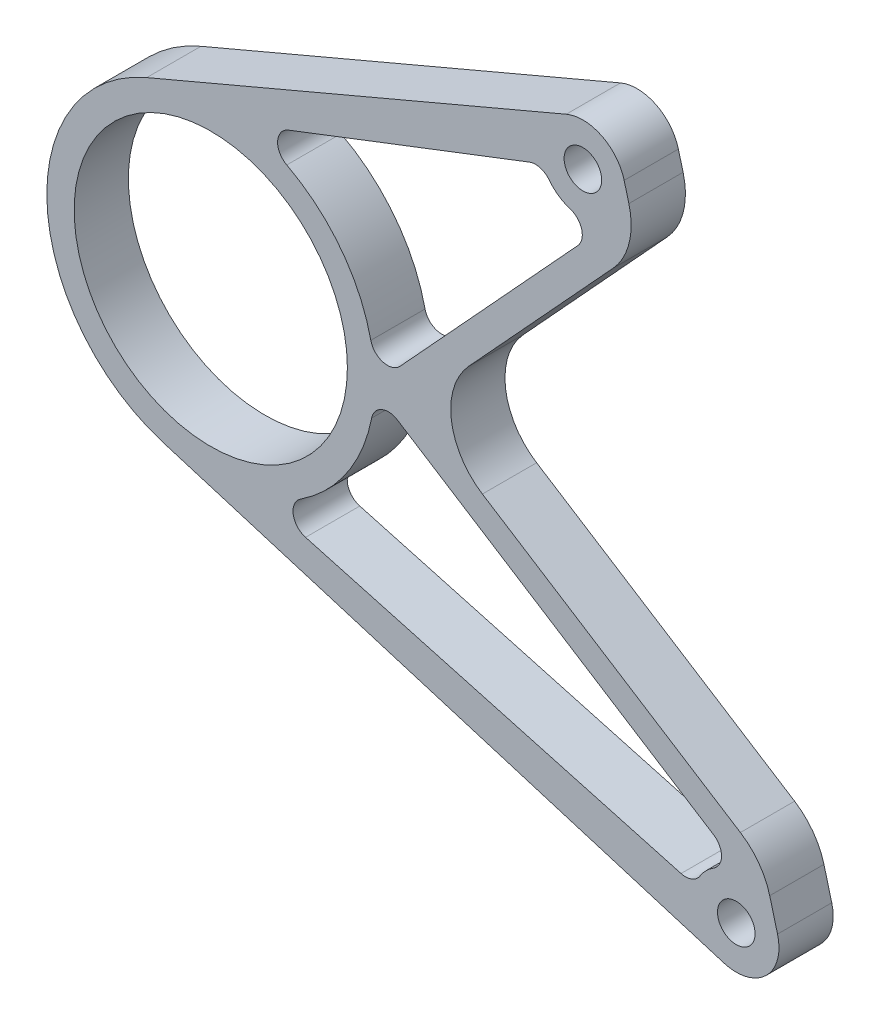
ISO-10303-21;
HEADER;
FILE_DESCRIPTION(('STEP AP214'),'2;1');
FILE_NAME('part.step','',(''),(''),'','','');
FILE_SCHEMA(('AUTOMOTIVE_DESIGN { 1 0 10303 214 1 1 1 1 }'));
ENDSEC;
DATA;
#1=APPLICATION_CONTEXT('core data for automotive mechanical design processes');
#2=APPLICATION_PROTOCOL_DEFINITION('international standard','automotive_design',2000,#1);
#3=PRODUCT_CONTEXT('',#1,'mechanical');
#4=PRODUCT('Part','Part','',(#3));
#5=PRODUCT_RELATED_PRODUCT_CATEGORY('part','',(#4));
#6=PRODUCT_DEFINITION_FORMATION('','',#4);
#7=PRODUCT_DEFINITION_CONTEXT('part definition',#1,'design');
#8=PRODUCT_DEFINITION('design','',#6,#7);
#9=PRODUCT_DEFINITION_SHAPE('','',#8);
#10=(LENGTH_UNIT() NAMED_UNIT(*) SI_UNIT(.MILLI.,.METRE.));
#11=(NAMED_UNIT(*) PLANE_ANGLE_UNIT() SI_UNIT($,.RADIAN.));
#12=(NAMED_UNIT(*) SI_UNIT($,.STERADIAN.) SOLID_ANGLE_UNIT());
#13=UNCERTAINTY_MEASURE_WITH_UNIT(LENGTH_MEASURE(1.E-05),#10,'distance_accuracy_value','');
#14=(GEOMETRIC_REPRESENTATION_CONTEXT(3) GLOBAL_UNCERTAINTY_ASSIGNED_CONTEXT((#13)) GLOBAL_UNIT_ASSIGNED_CONTEXT((#10,
#11,#12)) REPRESENTATION_CONTEXT('',''));
#15=CARTESIAN_POINT('',(0.,0.,0.));
#16=DIRECTION('',(0.,0.,1.));
#17=DIRECTION('',(1.,0.,0.));
#18=AXIS2_PLACEMENT_3D('',#15,#16,#17);
#19=CARTESIAN_POINT('',(37.2580750634411,-180.788741440238,15.875));
#20=DIRECTION('',(-0.966328629535843,-0.257311056387749,0.));
#21=DIRECTION('',(0.257311056387749,-0.966328629535843,0.));
#22=AXIS2_PLACEMENT_3D('',#19,#20,#21);
#23=PLANE('',#22);
#24=DIRECTION('',(-0.257311056387749,0.966328629535843,0.));
#25=VECTOR('',#24,1.);
#26=CARTESIAN_POINT('',(37.2580750634411,-180.788741440238,0.));
#27=LINE('',#26,#25);
#28=CARTESIAN_POINT('',(37.2580750634411,-180.788741440238,0.));
#29=VERTEX_POINT('',#28);
#30=CARTESIAN_POINT('',(34.971365168203,-172.201029469239,0.));
#31=VERTEX_POINT('',#30);
#32=EDGE_CURVE('E462',#29,#31,#27,.T.);
#33=ORIENTED_EDGE('',*,*,#32,.T.);
#34=DIRECTION('',(0.,0.,1.));
#35=VECTOR('',#34,1.);
#36=CARTESIAN_POINT('',(34.971365168203,-172.201029469239,15.875));
#37=LINE('',#36,#35);
#38=CARTESIAN_POINT('',(34.971365168203,-172.201029469239,15.875));
#39=VERTEX_POINT('',#38);
#40=EDGE_CURVE('E335',#31,#39,#37,.T.);
#41=ORIENTED_EDGE('',*,*,#40,.T.);
#42=DIRECTION('',(-0.257311056387749,0.966328629535843,0.));
#43=VECTOR('',#42,1.);
#44=CARTESIAN_POINT('',(37.2580750634411,-180.788741440238,15.875));
#45=LINE('',#44,#43);
#46=CARTESIAN_POINT('',(37.2580750634411,-180.788741440238,15.875));
#47=VERTEX_POINT('',#46);
#48=EDGE_CURVE('E450',#47,#39,#45,.T.);
#49=ORIENTED_EDGE('',*,*,#48,.F.);
#50=DIRECTION('',(0.,0.,-1.));
#51=VECTOR('',#50,1.);
#52=CARTESIAN_POINT('',(37.2580750634411,-180.788741440238,15.875));
#53=LINE('',#52,#51);
#54=EDGE_CURVE('E262',#47,#29,#53,.T.);
#55=ORIENTED_EDGE('',*,*,#54,.T.);
#56=EDGE_LOOP('',(#33,#41,#49,#55));
#57=FACE_BOUND('',#56,.T.);
#58=ADVANCED_FACE('F44',(#57),#23,.F.);
#59=CARTESIAN_POINT('',(-128.679206861492,-100.153402069267,15.875));
#60=DIRECTION('',(0.,0.,1.));
#61=DIRECTION('',(1.,0.,0.));
#62=AXIS2_PLACEMENT_3D('',#59,#60,#61);
#63=PLANE('',#62);
#64=ORIENTED_EDGE('',*,*,#48,.T.);
#65=CARTESIAN_POINT('',(15.6447925774861,-177.347250596994,15.875));
#66=DIRECTION('',(0.,0.,1.));
#67=DIRECTION('',(1.,0.,0.));
#68=AXIS2_PLACEMENT_3D('',#65,#66,#67);
#69=CIRCLE('',#68,20.);
#70=CARTESIAN_POINT('',(26.3798790276327,-160.472478927194,15.875));
#71=VERTEX_POINT('',#70);
#72=EDGE_CURVE('E340',#39,#71,#69,.T.);
#73=ORIENTED_EDGE('',*,*,#72,.T.);
#74=DIRECTION('',(0.843738583489993,-0.536754322507327,0.));
#75=VECTOR('',#74,1.);
#76=CARTESIAN_POINT('',(-69.306214402676,-99.6006339534629,15.875));
#77=LINE('',#76,#75);
#78=CARTESIAN_POINT('',(-49.1531232196023,-112.421262304551,15.875));
#79=VERTEX_POINT('',#78);
#80=EDGE_CURVE('E359',#79,#71,#77,.T.);
#81=ORIENTED_EDGE('',*,*,#80,.F.);
#82=CARTESIAN_POINT('',(-38.4180367694558,-95.5464906347516,15.875));
#83=DIRECTION('',(0.,0.,1.));
#84=DIRECTION('',(1.,0.,0.));
#85=AXIS2_PLACEMENT_3D('',#82,#83,#84);
#86=CIRCLE('',#85,20.);
#87=CARTESIAN_POINT('',(-53.1442022763909,-82.0135659891935,15.875));
#88=VERTEX_POINT('',#87);
#89=EDGE_CURVE('E52',#79,#88,#86,.F.);
#90=ORIENTED_EDGE('',*,*,#89,.T.);
#91=DIRECTION('',(-0.676646232277906,-0.736308275346755,0.));
#92=VECTOR('',#91,1.);
#93=CARTESIAN_POINT('',(-69.306214402676,-99.6006339534629,15.875));
#94=LINE('',#93,#92);
#95=CARTESIAN_POINT('',(-10.8675909821819,-36.0092918727903,15.875));
#96=VERTEX_POINT('',#95);
#97=EDGE_CURVE('E357',#96,#88,#94,.T.);
#98=ORIENTED_EDGE('',*,*,#97,.F.);
#99=CARTESIAN_POINT('',(-25.593756489117,-22.4763672272322,15.875));
#100=DIRECTION('',(0.,0.,1.));
#101=DIRECTION('',(1.,0.,0.));
#102=AXIS2_PLACEMENT_3D('',#99,#100,#101);
#103=CIRCLE('',#102,20.);
#104=CARTESIAN_POINT('',(-6.26718389840009,-17.3301460994772,15.875));
#105=VERTEX_POINT('',#104);
#106=EDGE_CURVE('E338',#96,#105,#103,.T.);
#107=ORIENTED_EDGE('',*,*,#106,.T.);
#108=CARTESIAN_POINT('',(-7.64952709503113,-12.1387725708725,15.875));
#109=VERTEX_POINT('',#108);
#110=EDGE_CURVE('E449',#105,#109,#45,.T.);
#111=ORIENTED_EDGE('',*,*,#110,.T.);
#112=CARTESIAN_POINT('',(-19.7286349642292,-15.3551607757193,15.875));
#113=DIRECTION('',(0.,0.,1.));
#114=DIRECTION('',(1.,0.,0.));
#115=AXIS2_PLACEMENT_3D('',#112,#113,#114);
#116=CIRCLE('',#115,12.5);
#117=CARTESIAN_POINT('',(-24.6116367720909,-3.84836741942675,15.875));
#118=VERTEX_POINT('',#117);
#119=EDGE_CURVE('E452',#109,#118,#116,.T.);
#120=ORIENTED_EDGE('',*,*,#119,.T.);
#121=DIRECTION('',(-0.920543468503407,-0.390640144628937,0.));
#122=VECTOR('',#121,1.);
#123=CARTESIAN_POINT('',(-24.6116367720909,-3.84836741942675,15.875));
#124=LINE('',#123,#122);
#125=CARTESIAN_POINT('',(-147.429933803682,-55.9673155811047,15.875));
#126=VERTEX_POINT('',#125);
#127=EDGE_CURVE('E249',#118,#126,#124,.T.);
#128=ORIENTED_EDGE('',*,*,#127,.T.);
#129=CARTESIAN_POINT('',(-128.679206861492,-100.153402069267,15.875));
#130=DIRECTION('',(0.,0.,1.));
#131=DIRECTION('',(1.,0.,0.));
#132=AXIS2_PLACEMENT_3D('',#129,#130,#131);
#133=CIRCLE('',#132,48.0000000000003);
#134=CARTESIAN_POINT('',(-142.633865887239,-146.080164326967,15.875));
#135=VERTEX_POINT('',#134);
#136=EDGE_CURVE('E242',#126,#135,#133,.T.);
#137=ORIENTED_EDGE('',*,*,#136,.T.);
#138=DIRECTION('',(0.956807547035382,-0.290722063036392,0.));
#139=VECTOR('',#138,1.);
#140=CARTESIAN_POINT('',(-142.633865887239,-146.080164326967,15.875));
#141=LINE('',#140,#139);
#142=CARTESIAN_POINT('',(21.5449414062881,-195.965223983027,15.875));
#143=VERTEX_POINT('',#142);
#144=EDGE_CURVE('E231',#135,#143,#141,.T.);
#145=ORIENTED_EDGE('',*,*,#144,.T.);
#146=CARTESIAN_POINT('',(25.178967194243,-184.005129645085,15.875));
#147=DIRECTION('',(0.,0.,1.));
#148=DIRECTION('',(1.,0.,0.));
#149=AXIS2_PLACEMENT_3D('',#146,#147,#148);
#150=CIRCLE('',#149,12.5);
#151=EDGE_CURVE('E241',#143,#47,#150,.T.);
#152=ORIENTED_EDGE('',*,*,#151,.T.);
#153=EDGE_LOOP('',(#64,#73,#81,#90,#98,#107,#111,#120,#128,#137,#145,#152));
#154=FACE_BOUND('',#153,.T.);
#155=CARTESIAN_POINT('',(-19.7286349642292,-15.3551607757193,15.875));
#156=DIRECTION('',(0.,0.,1.));
#157=DIRECTION('',(1.,0.,0.));
#158=AXIS2_PLACEMENT_3D('',#155,#156,#157);
#159=CIRCLE('',#158,5.49999999999995);
#160=CARTESIAN_POINT('',(-14.2286349642292,-15.3551607757193,15.875));
#161=VERTEX_POINT('',#160);
#162=EDGE_CURVE('E437',#161,#161,#159,.T.);
#163=ORIENTED_EDGE('',*,*,#162,.F.);
#164=EDGE_LOOP('',(#163));
#165=FACE_BOUND('',#164,.T.);
#166=CARTESIAN_POINT('',(-128.679206861492,-100.153402069267,15.875));
#167=DIRECTION('',(0.,0.,1.));
#168=DIRECTION('',(1.,0.,0.));
#169=AXIS2_PLACEMENT_3D('',#166,#167,#168);
#170=CIRCLE('',#169,40.);
#171=CARTESIAN_POINT('',(-88.6792068614918,-100.153402069267,15.875));
#172=VERTEX_POINT('',#171);
#173=EDGE_CURVE('E443',#172,#172,#170,.T.);
#174=ORIENTED_EDGE('',*,*,#173,.F.);
#175=EDGE_LOOP('',(#174));
#176=FACE_BOUND('',#175,.T.);
#177=CARTESIAN_POINT('',(25.178967194243,-184.005129645085,15.875));
#178=DIRECTION('',(0.,0.,1.));
#179=DIRECTION('',(1.,0.,0.));
#180=AXIS2_PLACEMENT_3D('',#177,#178,#179);
#181=CIRCLE('',#180,5.50000000000196);
#182=CARTESIAN_POINT('',(30.678967194245,-184.005129645085,15.875));
#183=VERTEX_POINT('',#182);
#184=EDGE_CURVE('E431',#183,#183,#181,.T.);
#185=ORIENTED_EDGE('',*,*,#184,.F.);
#186=EDGE_LOOP('',(#185));
#187=FACE_BOUND('',#186,.T.);
#188=CARTESIAN_POINT('',(-128.679206861492,-100.153402069267,15.875));
#189=DIRECTION('',(0.,0.,1.));
#190=DIRECTION('',(1.,0.,0.));
#191=AXIS2_PLACEMENT_3D('',#188,#189,#190);
#192=CIRCLE('',#191,48.0000000000003);
#193=CARTESIAN_POINT('',(-102.342203031375,-140.282720892945,15.875));
#194=VERTEX_POINT('',#193);
#195=CARTESIAN_POINT('',(-81.5718240006793,-109.367222124209,15.875));
#196=VERTEX_POINT('',#195);
#197=EDGE_CURVE('E426',#194,#196,#192,.T.);
#198=ORIENTED_EDGE('',*,*,#197,.T.);
#199=CARTESIAN_POINT('',(-76.6648049526781,-110.326995046599,15.875));
#200=DIRECTION('',(0.,0.,1.));
#201=DIRECTION('',(1.,0.,0.));
#202=AXIS2_PLACEMENT_3D('',#199,#200,#201);
#203=CIRCLE('',#202,5.);
#204=CARTESIAN_POINT('',(-73.9810333401415,-106.108302129149,15.875));
#205=VERTEX_POINT('',#204);
#206=EDGE_CURVE('E311',#196,#205,#203,.F.);
#207=ORIENTED_EDGE('',*,*,#206,.T.);
#208=DIRECTION('',(0.843738583489993,-0.536754322507327,0.));
#209=VECTOR('',#208,1.);
#210=CARTESIAN_POINT('',(-69.3686836788104,-109.042503155484,15.875));
#211=LINE('',#210,#209);
#212=CARTESIAN_POINT('',(18.5477178576202,-164.97156633614,15.875));
#213=VERTEX_POINT('',#212);
#214=EDGE_CURVE('E423',#205,#213,#211,.T.);
#215=ORIENTED_EDGE('',*,*,#214,.T.);
#216=CARTESIAN_POINT('',(15.8639462450835,-169.19025925359,15.875));
#217=DIRECTION('',(0.,0.,1.));
#218=DIRECTION('',(1.,0.,0.));
#219=AXIS2_PLACEMENT_3D('',#216,#217,#218);
#220=CIRCLE('',#219,5.);
#221=CARTESIAN_POINT('',(18.525380801986,-173.423079365445,15.875));
#222=VERTEX_POINT('',#221);
#223=EDGE_CURVE('E303',#213,#222,#220,.F.);
#224=ORIENTED_EDGE('',*,*,#223,.T.);
#225=CARTESIAN_POINT('',(25.178967194243,-184.005129645085,15.875));
#226=DIRECTION('',(0.,0.,1.));
#227=DIRECTION('',(1.,0.,0.));
#228=AXIS2_PLACEMENT_3D('',#225,#226,#227);
#229=CIRCLE('',#228,12.500000000002);
#230=CARTESIAN_POINT('',(14.5778884308564,-177.381903161525,15.875));
#231=VERTEX_POINT('',#230);
#232=EDGE_CURVE('E379',#222,#231,#229,.T.);
#233=ORIENTED_EDGE('',*,*,#232,.T.);
#234=CARTESIAN_POINT('',(10.3374569255024,-174.732612568102,15.875));
#235=DIRECTION('',(0.,0.,1.));
#236=DIRECTION('',(1.,0.,0.));
#237=AXIS2_PLACEMENT_3D('',#234,#235,#236);
#238=CIRCLE('',#237,5.);
#239=CARTESIAN_POINT('',(9.01015427315541,-179.553221209038,15.875));
#240=VERTEX_POINT('',#239);
#241=EDGE_CURVE('E307',#231,#240,#238,.F.);
#242=ORIENTED_EDGE('',*,*,#241,.T.);
#243=DIRECTION('',(0.964121728187319,-0.265460530469406,0.));
#244=VECTOR('',#243,1.);
#245=CARTESIAN_POINT('',(-45.3192416734976,-164.594207376629,15.875));
#246=LINE('',#245,#244);
#247=CARTESIAN_POINT('',(-100.926067784752,-149.283466911348,15.875));
#248=VERTEX_POINT('',#247);
#249=EDGE_CURVE('E413',#248,#240,#246,.T.);
#250=ORIENTED_EDGE('',*,*,#249,.F.);
#251=CARTESIAN_POINT('',(-99.5987651324046,-144.462858270412,15.875));
#252=DIRECTION('',(0.,0.,1.));
#253=DIRECTION('',(1.,0.,0.));
#254=AXIS2_PLACEMENT_3D('',#251,#252,#253);
#255=CIRCLE('',#254,5.);
#256=EDGE_CURVE('E315',#248,#194,#255,.F.);
#257=ORIENTED_EDGE('',*,*,#256,.T.);
#258=EDGE_LOOP('',(#198,#207,#215,#224,#233,#242,#250,#257));
#259=FACE_BOUND('',#258,.T.);
#260=CARTESIAN_POINT('',(-128.679206861492,-100.153402069267,15.875));
#261=DIRECTION('',(0.,0.,1.));
#262=DIRECTION('',(1.,0.,0.));
#263=AXIS2_PLACEMENT_3D('',#260,#261,#262);
#264=CIRCLE('',#263,48.0000000000003);
#265=CARTESIAN_POINT('',(-81.8156833325436,-89.7702348043259,15.875));
#266=VERTEX_POINT('',#265);
#267=CARTESIAN_POINT('',(-106.42717831002,-57.6228574531382,15.875));
#268=VERTEX_POINT('',#267);
#269=EDGE_CURVE('E404',#266,#268,#264,.T.);
#270=ORIENTED_EDGE('',*,*,#269,.T.);
#271=CARTESIAN_POINT('',(-104.109258669242,-53.1925923889582,15.875));
#272=DIRECTION('',(0.,0.,1.));
#273=DIRECTION('',(1.,0.,0.));
#274=AXIS2_PLACEMENT_3D('',#271,#272,#273);
#275=CIRCLE('',#274,5.);
#276=CARTESIAN_POINT('',(-105.905393307906,-48.5263411784264,15.875));
#277=VERTEX_POINT('',#276);
#278=EDGE_CURVE('E323',#268,#277,#275,.F.);
#279=ORIENTED_EDGE('',*,*,#278,.T.);
#280=DIRECTION('',(0.933250242106359,0.359226927732906,0.));
#281=VECTOR('',#280,1.);
#282=CARTESIAN_POINT('',(2.60193473174126,-6.75967203702486,15.875));
#283=LINE('',#282,#281);
#284=CARTESIAN_POINT('',(-35.3797173244889,-21.3795794989131,15.875));
#285=VERTEX_POINT('',#284);
#286=EDGE_CURVE('E400',#277,#285,#283,.T.);
#287=ORIENTED_EDGE('',*,*,#286,.T.);
#288=CARTESIAN_POINT('',(-33.5835826858244,-26.0458307094449,15.875));
#289=DIRECTION('',(0.,0.,1.));
#290=DIRECTION('',(1.,0.,0.));
#291=AXIS2_PLACEMENT_3D('',#288,#289,#290);
#292=CIRCLE('',#291,5.);
#293=CARTESIAN_POINT('',(-29.6250261939401,-22.9913535855233,15.875));
#294=VERTEX_POINT('',#293);
#295=EDGE_CURVE('E331',#285,#294,#292,.F.);
#296=ORIENTED_EDGE('',*,*,#295,.T.);
#297=CARTESIAN_POINT('',(-19.7286349642292,-15.3551607757192,15.875));
#298=DIRECTION('',(0.,0.,1.));
#299=DIRECTION('',(1.,0.,0.));
#300=AXIS2_PLACEMENT_3D('',#297,#298,#299);
#301=CIRCLE('',#300,12.5);
#302=CARTESIAN_POINT('',(-23.426066575477,-27.2958056276586,15.875));
#303=VERTEX_POINT('',#302);
#304=EDGE_CURVE('E397',#294,#303,#301,.T.);
#305=ORIENTED_EDGE('',*,*,#304,.T.);
#306=CARTESIAN_POINT('',(-24.9050392199761,-32.0720635684343,15.875));
#307=DIRECTION('',(0.,0.,1.));
#308=DIRECTION('',(1.,0.,0.));
#309=AXIS2_PLACEMENT_3D('',#306,#307,#308);
#310=CIRCLE('',#309,5.);
#311=CARTESIAN_POINT('',(-21.2234978432423,-35.4552947298239,15.875));
#312=VERTEX_POINT('',#311);
#313=EDGE_CURVE('E327',#303,#312,#310,.F.);
#314=ORIENTED_EDGE('',*,*,#313,.T.);
#315=DIRECTION('',(-0.676646232277907,-0.736308275346755,0.));
#316=VECTOR('',#315,1.);
#317=CARTESIAN_POINT('',(6.15822802008964,-5.6592353051302,15.875));
#318=LINE('',#317,#316);
#319=CARTESIAN_POINT('',(-73.2525249215444,-92.0718860422841,15.875));
#320=VERTEX_POINT('',#319);
#321=EDGE_CURVE('E387',#312,#320,#318,.T.);
#322=ORIENTED_EDGE('',*,*,#321,.T.);
#323=CARTESIAN_POINT('',(-76.9340662982782,-88.6886548808946,15.875));
#324=DIRECTION('',(0.,0.,1.));
#325=DIRECTION('',(1.,0.,0.));
#326=AXIS2_PLACEMENT_3D('',#323,#324,#325);
#327=CIRCLE('',#326,5.);
#328=EDGE_CURVE('E319',#320,#266,#327,.F.);
#329=ORIENTED_EDGE('',*,*,#328,.T.);
#330=EDGE_LOOP('',(#270,#279,#287,#296,#305,#314,#322,#329));
#331=FACE_BOUND('',#330,.T.);
#332=ADVANCED_FACE('F246',(#154,#165,#176,#187,#259,#331),#63,.T.);
#333=CARTESIAN_POINT('',(-128.679206861492,-100.153402069267,0.));
#334=DIRECTION('',(0.,0.,1.));
#335=DIRECTION('',(1.,0.,0.));
#336=AXIS2_PLACEMENT_3D('',#333,#334,#335);
#337=PLANE('',#336);
#338=CARTESIAN_POINT('',(25.178967194243,-184.005129645085,0.));
#339=DIRECTION('',(0.,0.,1.));
#340=DIRECTION('',(1.,0.,0.));
#341=AXIS2_PLACEMENT_3D('',#338,#339,#340);
#342=CIRCLE('',#341,12.500000000002);
#343=CARTESIAN_POINT('',(18.525380801986,-173.423079365445,0.));
#344=VERTEX_POINT('',#343);
#345=CARTESIAN_POINT('',(14.5778884308564,-177.381903161525,0.));
#346=VERTEX_POINT('',#345);
#347=EDGE_CURVE('E409',#344,#346,#342,.T.);
#348=ORIENTED_EDGE('',*,*,#347,.F.);
#349=CARTESIAN_POINT('',(15.8639462450835,-169.19025925359,0.));
#350=DIRECTION('',(0.,0.,1.));
#351=DIRECTION('',(1.,0.,0.));
#352=AXIS2_PLACEMENT_3D('',#349,#350,#351);
#353=CIRCLE('',#352,5.);
#354=CARTESIAN_POINT('',(18.5477178576202,-164.97156633614,0.));
#355=VERTEX_POINT('',#354);
#356=EDGE_CURVE('E305',#344,#355,#353,.T.);
#357=ORIENTED_EDGE('',*,*,#356,.T.);
#358=DIRECTION('',(0.843738583489993,-0.536754322507327,0.));
#359=VECTOR('',#358,1.);
#360=CARTESIAN_POINT('',(-69.3686836788104,-109.042503155484,0.));
#361=LINE('',#360,#359);
#362=CARTESIAN_POINT('',(-73.9810333401415,-106.108302129149,0.));
#363=VERTEX_POINT('',#362);
#364=EDGE_CURVE('E412',#363,#355,#361,.T.);
#365=ORIENTED_EDGE('',*,*,#364,.F.);
#366=CARTESIAN_POINT('',(-76.6648049526781,-110.326995046599,0.));
#367=DIRECTION('',(0.,0.,1.));
#368=DIRECTION('',(1.,0.,0.));
#369=AXIS2_PLACEMENT_3D('',#366,#367,#368);
#370=CIRCLE('',#369,5.);
#371=CARTESIAN_POINT('',(-81.5718240006793,-109.367222124209,0.));
#372=VERTEX_POINT('',#371);
#373=EDGE_CURVE('E313',#363,#372,#370,.T.);
#374=ORIENTED_EDGE('',*,*,#373,.T.);
#375=CARTESIAN_POINT('',(-128.679206861492,-100.153402069267,0.));
#376=DIRECTION('',(0.,0.,1.));
#377=DIRECTION('',(1.,0.,0.));
#378=AXIS2_PLACEMENT_3D('',#375,#376,#377);
#379=CIRCLE('',#378,48.0000000000003);
#380=CARTESIAN_POINT('',(-102.342203031375,-140.282720892945,0.));
#381=VERTEX_POINT('',#380);
#382=EDGE_CURVE('E416',#381,#372,#379,.T.);
#383=ORIENTED_EDGE('',*,*,#382,.F.);
#384=CARTESIAN_POINT('',(-99.5987651324046,-144.462858270412,0.));
#385=DIRECTION('',(0.,0.,1.));
#386=DIRECTION('',(1.,0.,0.));
#387=AXIS2_PLACEMENT_3D('',#384,#385,#386);
#388=CIRCLE('',#387,5.);
#389=CARTESIAN_POINT('',(-100.926067784752,-149.283466911348,0.));
#390=VERTEX_POINT('',#389);
#391=EDGE_CURVE('E317',#381,#390,#388,.T.);
#392=ORIENTED_EDGE('',*,*,#391,.T.);
#393=DIRECTION('',(0.964121728187319,-0.265460530469406,0.));
#394=VECTOR('',#393,1.);
#395=CARTESIAN_POINT('',(-45.3192416734976,-164.594207376629,0.));
#396=LINE('',#395,#394);
#397=CARTESIAN_POINT('',(9.01015427315541,-179.553221209038,0.));
#398=VERTEX_POINT('',#397);
#399=EDGE_CURVE('E401',#390,#398,#396,.T.);
#400=ORIENTED_EDGE('',*,*,#399,.T.);
#401=CARTESIAN_POINT('',(10.3374569255024,-174.732612568102,0.));
#402=DIRECTION('',(0.,0.,1.));
#403=DIRECTION('',(1.,0.,0.));
#404=AXIS2_PLACEMENT_3D('',#401,#402,#403);
#405=CIRCLE('',#404,5.);
#406=EDGE_CURVE('E309',#398,#346,#405,.T.);
#407=ORIENTED_EDGE('',*,*,#406,.T.);
#408=EDGE_LOOP('',(#348,#357,#365,#374,#383,#392,#400,#407));
#409=FACE_BOUND('',#408,.T.);
#410=DIRECTION('',(0.843738583489993,-0.536754322507327,0.));
#411=VECTOR('',#410,1.);
#412=CARTESIAN_POINT('',(-69.306214402676,-99.6006339534629,0.));
#413=LINE('',#412,#411);
#414=CARTESIAN_POINT('',(-49.1531232196023,-112.421262304551,0.));
#415=VERTEX_POINT('',#414);
#416=CARTESIAN_POINT('',(26.3798790276327,-160.472478927194,0.));
#417=VERTEX_POINT('',#416);
#418=EDGE_CURVE('E364',#415,#417,#413,.T.);
#419=ORIENTED_EDGE('',*,*,#418,.T.);
#420=CARTESIAN_POINT('',(15.6447925774861,-177.347250596994,0.));
#421=DIRECTION('',(0.,0.,1.));
#422=DIRECTION('',(1.,0.,0.));
#423=AXIS2_PLACEMENT_3D('',#420,#421,#422);
#424=CIRCLE('',#423,20.);
#425=EDGE_CURVE('E349',#417,#31,#424,.F.);
#426=ORIENTED_EDGE('',*,*,#425,.T.);
#427=ORIENTED_EDGE('',*,*,#32,.F.);
#428=CARTESIAN_POINT('',(25.178967194243,-184.005129645085,0.));
#429=DIRECTION('',(0.,0.,1.));
#430=DIRECTION('',(1.,0.,0.));
#431=AXIS2_PLACEMENT_3D('',#428,#429,#430);
#432=CIRCLE('',#431,12.5);
#433=CARTESIAN_POINT('',(21.5449414062881,-195.965223983027,0.));
#434=VERTEX_POINT('',#433);
#435=EDGE_CURVE('E459',#434,#29,#432,.T.);
#436=ORIENTED_EDGE('',*,*,#435,.F.);
#437=DIRECTION('',(0.956807547035382,-0.290722063036392,0.));
#438=VECTOR('',#437,1.);
#439=CARTESIAN_POINT('',(-142.633865887239,-146.080164326967,0.));
#440=LINE('',#439,#438);
#441=CARTESIAN_POINT('',(-142.633865887239,-146.080164326967,0.));
#442=VERTEX_POINT('',#441);
#443=EDGE_CURVE('E457',#442,#434,#440,.T.);
#444=ORIENTED_EDGE('',*,*,#443,.F.);
#445=CARTESIAN_POINT('',(-128.679206861492,-100.153402069267,0.));
#446=DIRECTION('',(0.,0.,1.));
#447=DIRECTION('',(1.,0.,0.));
#448=AXIS2_PLACEMENT_3D('',#445,#446,#447);
#449=CIRCLE('',#448,48.0000000000003);
#450=CARTESIAN_POINT('',(-147.429933803682,-55.9673155811047,0.));
#451=VERTEX_POINT('',#450);
#452=EDGE_CURVE('E257',#451,#442,#449,.T.);
#453=ORIENTED_EDGE('',*,*,#452,.F.);
#454=DIRECTION('',(-0.920543468503407,-0.390640144628937,0.));
#455=VECTOR('',#454,1.);
#456=CARTESIAN_POINT('',(-24.6116367720909,-3.84836741942675,0.));
#457=LINE('',#456,#455);
#458=CARTESIAN_POINT('',(-24.6116367720909,-3.84836741942675,0.));
#459=VERTEX_POINT('',#458);
#460=EDGE_CURVE('E253',#459,#451,#457,.T.);
#461=ORIENTED_EDGE('',*,*,#460,.F.);
#462=CARTESIAN_POINT('',(-19.7286349642292,-15.3551607757193,0.));
#463=DIRECTION('',(0.,0.,1.));
#464=DIRECTION('',(1.,0.,0.));
#465=AXIS2_PLACEMENT_3D('',#462,#463,#464);
#466=CIRCLE('',#465,12.5);
#467=CARTESIAN_POINT('',(-7.64952709503113,-12.1387725708725,0.));
#468=VERTEX_POINT('',#467);
#469=EDGE_CURVE('E465',#468,#459,#466,.T.);
#470=ORIENTED_EDGE('',*,*,#469,.F.);
#471=CARTESIAN_POINT('',(-6.26718389840009,-17.3301460994772,0.));
#472=VERTEX_POINT('',#471);
#473=EDGE_CURVE('E461',#472,#468,#27,.T.);
#474=ORIENTED_EDGE('',*,*,#473,.F.);
#475=CARTESIAN_POINT('',(-25.593756489117,-22.4763672272322,0.));
#476=DIRECTION('',(0.,0.,1.));
#477=DIRECTION('',(1.,0.,0.));
#478=AXIS2_PLACEMENT_3D('',#475,#476,#477);
#479=CIRCLE('',#478,20.);
#480=CARTESIAN_POINT('',(-10.8675909821819,-36.0092918727903,0.));
#481=VERTEX_POINT('',#480);
#482=EDGE_CURVE('E347',#472,#481,#479,.F.);
#483=ORIENTED_EDGE('',*,*,#482,.T.);
#484=DIRECTION('',(-0.676646232277906,-0.736308275346755,0.));
#485=VECTOR('',#484,1.);
#486=CARTESIAN_POINT('',(-69.306214402676,-99.6006339534629,0.));
#487=LINE('',#486,#485);
#488=CARTESIAN_POINT('',(-53.1442022763909,-82.0135659891935,0.));
#489=VERTEX_POINT('',#488);
#490=EDGE_CURVE('E374',#481,#489,#487,.T.);
#491=ORIENTED_EDGE('',*,*,#490,.T.);
#492=CARTESIAN_POINT('',(-38.4180367694558,-95.5464906347516,0.));
#493=DIRECTION('',(0.,0.,1.));
#494=DIRECTION('',(1.,0.,0.));
#495=AXIS2_PLACEMENT_3D('',#492,#493,#494);
#496=CIRCLE('',#495,20.);
#497=EDGE_CURVE('E11',#489,#415,#496,.T.);
#498=ORIENTED_EDGE('',*,*,#497,.T.);
#499=EDGE_LOOP('',(#419,#426,#427,#436,#444,#453,#461,#470,#474,#483,#491,#498));
#500=FACE_BOUND('',#499,.T.);
#501=CARTESIAN_POINT('',(-128.679206861492,-100.153402069267,0.));
#502=DIRECTION('',(0.,0.,1.));
#503=DIRECTION('',(1.,0.,0.));
#504=AXIS2_PLACEMENT_3D('',#501,#502,#503);
#505=CIRCLE('',#504,40.);
#506=CARTESIAN_POINT('',(-88.6792068614918,-100.153402069267,0.));
#507=VERTEX_POINT('',#506);
#508=EDGE_CURVE('E440',#507,#507,#505,.T.);
#509=ORIENTED_EDGE('',*,*,#508,.T.);
#510=EDGE_LOOP('',(#509));
#511=FACE_BOUND('',#510,.T.);
#512=CARTESIAN_POINT('',(-19.7286349642292,-15.3551607757193,0.));
#513=DIRECTION('',(0.,0.,1.));
#514=DIRECTION('',(1.,0.,0.));
#515=AXIS2_PLACEMENT_3D('',#512,#513,#514);
#516=CIRCLE('',#515,5.49999999999995);
#517=CARTESIAN_POINT('',(-14.2286349642292,-15.3551607757193,0.));
#518=VERTEX_POINT('',#517);
#519=EDGE_CURVE('E434',#518,#518,#516,.T.);
#520=ORIENTED_EDGE('',*,*,#519,.T.);
#521=EDGE_LOOP('',(#520));
#522=FACE_BOUND('',#521,.T.);
#523=CARTESIAN_POINT('',(25.178967194243,-184.005129645085,0.));
#524=DIRECTION('',(0.,0.,1.));
#525=DIRECTION('',(1.,0.,0.));
#526=AXIS2_PLACEMENT_3D('',#523,#524,#525);
#527=CIRCLE('',#526,5.50000000000196);
#528=CARTESIAN_POINT('',(30.678967194245,-184.005129645085,0.));
#529=VERTEX_POINT('',#528);
#530=EDGE_CURVE('E396',#529,#529,#527,.T.);
#531=ORIENTED_EDGE('',*,*,#530,.T.);
#532=EDGE_LOOP('',(#531));
#533=FACE_BOUND('',#532,.T.);
#534=CARTESIAN_POINT('',(-19.7286349642292,-15.3551607757192,0.));
#535=DIRECTION('',(0.,0.,1.));
#536=DIRECTION('',(1.,0.,0.));
#537=AXIS2_PLACEMENT_3D('',#534,#535,#536);
#538=CIRCLE('',#537,12.5);
#539=CARTESIAN_POINT('',(-29.6250261939401,-22.9913535855233,0.));
#540=VERTEX_POINT('',#539);
#541=CARTESIAN_POINT('',(-23.426066575477,-27.2958056276586,0.));
#542=VERTEX_POINT('',#541);
#543=EDGE_CURVE('E383',#540,#542,#538,.T.);
#544=ORIENTED_EDGE('',*,*,#543,.F.);
#545=CARTESIAN_POINT('',(-33.5835826858244,-26.0458307094449,0.));
#546=DIRECTION('',(0.,0.,1.));
#547=DIRECTION('',(1.,0.,0.));
#548=AXIS2_PLACEMENT_3D('',#545,#546,#547);
#549=CIRCLE('',#548,5.);
#550=CARTESIAN_POINT('',(-35.3797173244889,-21.3795794989131,0.));
#551=VERTEX_POINT('',#550);
#552=EDGE_CURVE('E333',#540,#551,#549,.T.);
#553=ORIENTED_EDGE('',*,*,#552,.T.);
#554=DIRECTION('',(0.933250242106359,0.359226927732906,0.));
#555=VECTOR('',#554,1.);
#556=CARTESIAN_POINT('',(2.60193473174126,-6.75967203702486,0.));
#557=LINE('',#556,#555);
#558=CARTESIAN_POINT('',(-105.905393307906,-48.5263411784264,0.));
#559=VERTEX_POINT('',#558);
#560=EDGE_CURVE('E386',#559,#551,#557,.T.);
#561=ORIENTED_EDGE('',*,*,#560,.F.);
#562=CARTESIAN_POINT('',(-104.109258669242,-53.1925923889582,0.));
#563=DIRECTION('',(0.,0.,1.));
#564=DIRECTION('',(1.,0.,0.));
#565=AXIS2_PLACEMENT_3D('',#562,#563,#564);
#566=CIRCLE('',#565,5.);
#567=CARTESIAN_POINT('',(-106.42717831002,-57.6228574531382,0.));
#568=VERTEX_POINT('',#567);
#569=EDGE_CURVE('E325',#559,#568,#566,.T.);
#570=ORIENTED_EDGE('',*,*,#569,.T.);
#571=CARTESIAN_POINT('',(-128.679206861492,-100.153402069267,0.));
#572=DIRECTION('',(0.,0.,1.));
#573=DIRECTION('',(1.,0.,0.));
#574=AXIS2_PLACEMENT_3D('',#571,#572,#573);
#575=CIRCLE('',#574,48.0000000000003);
#576=CARTESIAN_POINT('',(-81.8156833325436,-89.7702348043259,0.));
#577=VERTEX_POINT('',#576);
#578=EDGE_CURVE('E390',#577,#568,#575,.T.);
#579=ORIENTED_EDGE('',*,*,#578,.F.);
#580=CARTESIAN_POINT('',(-76.9340662982782,-88.6886548808946,0.));
#581=DIRECTION('',(0.,0.,1.));
#582=DIRECTION('',(1.,0.,0.));
#583=AXIS2_PLACEMENT_3D('',#580,#581,#582);
#584=CIRCLE('',#583,5.);
#585=CARTESIAN_POINT('',(-73.2525249215444,-92.0718860422841,0.));
#586=VERTEX_POINT('',#585);
#587=EDGE_CURVE('E321',#577,#586,#584,.T.);
#588=ORIENTED_EDGE('',*,*,#587,.T.);
#589=DIRECTION('',(-0.676646232277907,-0.736308275346755,0.));
#590=VECTOR('',#589,1.);
#591=CARTESIAN_POINT('',(6.15822802008964,-5.6592353051302,0.));
#592=LINE('',#591,#590);
#593=CARTESIAN_POINT('',(-21.2234978432423,-35.4552947298239,0.));
#594=VERTEX_POINT('',#593);
#595=EDGE_CURVE('E393',#594,#586,#592,.T.);
#596=ORIENTED_EDGE('',*,*,#595,.F.);
#597=CARTESIAN_POINT('',(-24.9050392199761,-32.0720635684343,0.));
#598=DIRECTION('',(0.,0.,1.));
#599=DIRECTION('',(1.,0.,0.));
#600=AXIS2_PLACEMENT_3D('',#597,#598,#599);
#601=CIRCLE('',#600,5.);
#602=EDGE_CURVE('E329',#594,#542,#601,.T.);
#603=ORIENTED_EDGE('',*,*,#602,.T.);
#604=EDGE_LOOP('',(#544,#553,#561,#570,#579,#588,#596,#603));
#605=FACE_BOUND('',#604,.T.);
#606=ADVANCED_FACE('F371',(#409,#500,#511,#522,#533,#605),#337,.F.);
#607=CARTESIAN_POINT('',(-128.679206861492,-100.153402069267,15.875));
#608=DIRECTION('',(0.,0.,-1.));
#609=DIRECTION('',(-1.,0.,0.));
#610=AXIS2_PLACEMENT_3D('',#607,#608,#609);
#611=CYLINDRICAL_SURFACE('',#610,48.0000000000003);
#612=ORIENTED_EDGE('',*,*,#452,.T.);
#613=DIRECTION('',(0.,0.,-1.));
#614=VECTOR('',#613,1.);
#615=CARTESIAN_POINT('',(-142.633865887239,-146.080164326967,15.875));
#616=LINE('',#615,#614);
#617=EDGE_CURVE('E235',#135,#442,#616,.T.);
#618=ORIENTED_EDGE('',*,*,#617,.F.);
#619=ORIENTED_EDGE('',*,*,#136,.F.);
#620=DIRECTION('',(0.,0.,-1.));
#621=VECTOR('',#620,1.);
#622=CARTESIAN_POINT('',(-147.429933803682,-55.9673155811047,15.875));
#623=LINE('',#622,#621);
#624=EDGE_CURVE('E455',#126,#451,#623,.T.);
#625=ORIENTED_EDGE('',*,*,#624,.T.);
#626=EDGE_LOOP('',(#612,#618,#619,#625));
#627=FACE_BOUND('',#626,.T.);
#628=ADVANCED_FACE('F255',(#627),#611,.T.);
#629=CARTESIAN_POINT('',(-142.633865887239,-146.080164326967,15.875));
#630=DIRECTION('',(0.290722063036392,0.956807547035382,0.));
#631=DIRECTION('',(-0.956807547035382,0.290722063036392,0.));
#632=AXIS2_PLACEMENT_3D('',#629,#630,#631);
#633=PLANE('',#632);
#634=ORIENTED_EDGE('',*,*,#443,.T.);
#635=DIRECTION('',(0.,0.,-1.));
#636=VECTOR('',#635,1.);
#637=CARTESIAN_POINT('',(21.5449414062881,-195.965223983027,15.875));
#638=LINE('',#637,#636);
#639=EDGE_CURVE('E238',#143,#434,#638,.T.);
#640=ORIENTED_EDGE('',*,*,#639,.F.);
#641=ORIENTED_EDGE('',*,*,#144,.F.);
#642=ORIENTED_EDGE('',*,*,#617,.T.);
#643=EDGE_LOOP('',(#634,#640,#641,#642));
#644=FACE_BOUND('',#643,.T.);
#645=ADVANCED_FACE('F233',(#644),#633,.F.);
#646=CARTESIAN_POINT('',(25.178967194243,-184.005129645085,15.875));
#647=DIRECTION('',(0.,0.,-1.));
#648=DIRECTION('',(-1.,0.,0.));
#649=AXIS2_PLACEMENT_3D('',#646,#647,#648);
#650=CYLINDRICAL_SURFACE('',#649,12.5);
#651=ORIENTED_EDGE('',*,*,#435,.T.);
#652=ORIENTED_EDGE('',*,*,#54,.F.);
#653=ORIENTED_EDGE('',*,*,#151,.F.);
#654=ORIENTED_EDGE('',*,*,#639,.T.);
#655=EDGE_LOOP('',(#651,#652,#653,#654));
#656=FACE_BOUND('',#655,.T.);
#657=ADVANCED_FACE('F484',(#656),#650,.T.);
#658=ORIENTED_EDGE('',*,*,#110,.F.);
#659=DIRECTION('',(0.,0.,1.));
#660=VECTOR('',#659,1.);
#661=CARTESIAN_POINT('',(-6.26718389840009,-17.3301460994772,15.875));
#662=LINE('',#661,#660);
#663=EDGE_CURVE('E59',#105,#472,#662,.F.);
#664=ORIENTED_EDGE('',*,*,#663,.T.);
#665=ORIENTED_EDGE('',*,*,#473,.T.);
#666=DIRECTION('',(0.,0.,-1.));
#667=VECTOR('',#666,1.);
#668=CARTESIAN_POINT('',(-7.64952709503113,-12.1387725708725,15.875));
#669=LINE('',#668,#667);
#670=EDGE_CURVE('E472',#109,#468,#669,.T.);
#671=ORIENTED_EDGE('',*,*,#670,.F.);
#672=EDGE_LOOP('',(#658,#664,#665,#671));
#673=FACE_BOUND('',#672,.T.);
#674=ADVANCED_FACE('F486',(#673),#23,.F.);
#675=CARTESIAN_POINT('',(-19.7286349642292,-15.3551607757193,15.875));
#676=DIRECTION('',(0.,0.,-1.));
#677=DIRECTION('',(-1.,0.,0.));
#678=AXIS2_PLACEMENT_3D('',#675,#676,#677);
#679=CYLINDRICAL_SURFACE('',#678,12.5);
#680=ORIENTED_EDGE('',*,*,#469,.T.);
#681=DIRECTION('',(0.,0.,-1.));
#682=VECTOR('',#681,1.);
#683=CARTESIAN_POINT('',(-24.6116367720909,-3.84836741942675,15.875));
#684=LINE('',#683,#682);
#685=EDGE_CURVE('E469',#118,#459,#684,.T.);
#686=ORIENTED_EDGE('',*,*,#685,.F.);
#687=ORIENTED_EDGE('',*,*,#119,.F.);
#688=ORIENTED_EDGE('',*,*,#670,.T.);
#689=EDGE_LOOP('',(#680,#686,#687,#688));
#690=FACE_BOUND('',#689,.T.);
#691=ADVANCED_FACE('F492',(#690),#679,.T.);
#692=CARTESIAN_POINT('',(-24.6116367720909,-3.84836741942675,15.875));
#693=DIRECTION('',(0.390640144628937,-0.920543468503407,0.));
#694=DIRECTION('',(0.920543468503407,0.390640144628937,0.));
#695=AXIS2_PLACEMENT_3D('',#692,#693,#694);
#696=PLANE('',#695);
#697=ORIENTED_EDGE('',*,*,#460,.T.);
#698=ORIENTED_EDGE('',*,*,#624,.F.);
#699=ORIENTED_EDGE('',*,*,#127,.F.);
#700=ORIENTED_EDGE('',*,*,#685,.T.);
#701=EDGE_LOOP('',(#697,#698,#699,#700));
#702=FACE_BOUND('',#701,.T.);
#703=ADVANCED_FACE('F503',(#702),#696,.F.);
#704=CARTESIAN_POINT('',(-128.679206861492,-100.153402069267,15.875));
#705=DIRECTION('',(0.,0.,-1.));
#706=DIRECTION('',(-1.,0.,0.));
#707=AXIS2_PLACEMENT_3D('',#704,#705,#706);
#708=CYLINDRICAL_SURFACE('',#707,40.);
#709=ORIENTED_EDGE('',*,*,#173,.T.);
#710=EDGE_LOOP('',(#709));
#711=FACE_BOUND('',#710,.T.);
#712=ORIENTED_EDGE('',*,*,#508,.F.);
#713=EDGE_LOOP('',(#712));
#714=FACE_BOUND('',#713,.T.);
#715=ADVANCED_FACE('F507',(#711,#714),#708,.F.);
#716=CARTESIAN_POINT('',(-19.7286349642292,-15.3551607757193,15.875));
#717=DIRECTION('',(0.,0.,-1.));
#718=DIRECTION('',(-1.,0.,0.));
#719=AXIS2_PLACEMENT_3D('',#716,#717,#718);
#720=CYLINDRICAL_SURFACE('',#719,5.49999999999995);
#721=ORIENTED_EDGE('',*,*,#162,.T.);
#722=EDGE_LOOP('',(#721));
#723=FACE_BOUND('',#722,.T.);
#724=ORIENTED_EDGE('',*,*,#519,.F.);
#725=EDGE_LOOP('',(#724));
#726=FACE_BOUND('',#725,.T.);
#727=ADVANCED_FACE('F514',(#723,#726),#720,.F.);
#728=CARTESIAN_POINT('',(25.178967194243,-184.005129645085,15.875));
#729=DIRECTION('',(0.,0.,-1.));
#730=DIRECTION('',(-1.,0.,0.));
#731=AXIS2_PLACEMENT_3D('',#728,#729,#730);
#732=CYLINDRICAL_SURFACE('',#731,5.50000000000196);
#733=ORIENTED_EDGE('',*,*,#184,.T.);
#734=EDGE_LOOP('',(#733));
#735=FACE_BOUND('',#734,.T.);
#736=ORIENTED_EDGE('',*,*,#530,.F.);
#737=EDGE_LOOP('',(#736));
#738=FACE_BOUND('',#737,.T.);
#739=ADVANCED_FACE('F518',(#735,#738),#732,.F.);
#740=CARTESIAN_POINT('',(25.178967194243,-184.005129645085,0.));
#741=DIRECTION('',(0.,0.,1.));
#742=DIRECTION('',(1.,0.,0.));
#743=AXIS2_PLACEMENT_3D('',#740,#741,#742);
#744=CYLINDRICAL_SURFACE('',#743,12.500000000002);
#745=ORIENTED_EDGE('',*,*,#232,.F.);
#746=DIRECTION('',(0.,0.,1.));
#747=VECTOR('',#746,1.);
#748=CARTESIAN_POINT('',(18.525380801986,-173.423079365445,0.));
#749=LINE('',#748,#747);
#750=EDGE_CURVE('E271',#222,#344,#749,.F.);
#751=ORIENTED_EDGE('',*,*,#750,.T.);
#752=ORIENTED_EDGE('',*,*,#347,.T.);
#753=DIRECTION('',(0.,0.,1.));
#754=VECTOR('',#753,1.);
#755=CARTESIAN_POINT('',(14.5778884308564,-177.381903161525,0.));
#756=LINE('',#755,#754);
#757=EDGE_CURVE('E268',#346,#231,#756,.T.);
#758=ORIENTED_EDGE('',*,*,#757,.T.);
#759=EDGE_LOOP('',(#745,#751,#752,#758));
#760=FACE_BOUND('',#759,.T.);
#761=ADVANCED_FACE('F522',(#760),#744,.T.);
#762=CARTESIAN_POINT('',(-45.3192416734976,-164.594207376629,0.));
#763=DIRECTION('',(-0.265460530469406,-0.964121728187318,0.));
#764=DIRECTION('',(0.964121728187319,-0.265460530469406,0.));
#765=AXIS2_PLACEMENT_3D('',#762,#763,#764);
#766=PLANE('',#765);
#767=ORIENTED_EDGE('',*,*,#249,.T.);
#768=DIRECTION('',(0.,0.,1.));
#769=VECTOR('',#768,1.);
#770=CARTESIAN_POINT('',(9.01015427315541,-179.553221209038,0.));
#771=LINE('',#770,#769);
#772=EDGE_CURVE('E276',#240,#398,#771,.F.);
#773=ORIENTED_EDGE('',*,*,#772,.T.);
#774=ORIENTED_EDGE('',*,*,#399,.F.);
#775=DIRECTION('',(0.,0.,1.));
#776=VECTOR('',#775,1.);
#777=CARTESIAN_POINT('',(-100.926067784752,-149.283466911348,0.));
#778=LINE('',#777,#776);
#779=EDGE_CURVE('E273',#390,#248,#778,.T.);
#780=ORIENTED_EDGE('',*,*,#779,.T.);
#781=EDGE_LOOP('',(#767,#773,#774,#780));
#782=FACE_BOUND('',#781,.T.);
#783=ADVANCED_FACE('F526',(#782),#766,.F.);
#784=CARTESIAN_POINT('',(-128.679206861492,-100.153402069267,0.));
#785=DIRECTION('',(0.,0.,1.));
#786=DIRECTION('',(1.,0.,0.));
#787=AXIS2_PLACEMENT_3D('',#784,#785,#786);
#788=CYLINDRICAL_SURFACE('',#787,48.0000000000003);
#789=ORIENTED_EDGE('',*,*,#382,.T.);
#790=DIRECTION('',(0.,0.,1.));
#791=VECTOR('',#790,1.);
#792=CARTESIAN_POINT('',(-81.5718240006793,-109.367222124209,0.));
#793=LINE('',#792,#791);
#794=EDGE_CURVE('E280',#372,#196,#793,.T.);
#795=ORIENTED_EDGE('',*,*,#794,.T.);
#796=ORIENTED_EDGE('',*,*,#197,.F.);
#797=DIRECTION('',(0.,0.,1.));
#798=VECTOR('',#797,1.);
#799=CARTESIAN_POINT('',(-102.342203031375,-140.282720892945,0.));
#800=LINE('',#799,#798);
#801=EDGE_CURVE('E278',#194,#381,#800,.F.);
#802=ORIENTED_EDGE('',*,*,#801,.T.);
#803=EDGE_LOOP('',(#789,#795,#796,#802));
#804=FACE_BOUND('',#803,.T.);
#805=ADVANCED_FACE('F532',(#804),#788,.T.);
#806=CARTESIAN_POINT('',(-69.3686836788104,-109.042503155484,0.));
#807=DIRECTION('',(-0.536754322507327,-0.843738583489993,0.));
#808=DIRECTION('',(0.843738583489993,-0.536754322507327,0.));
#809=AXIS2_PLACEMENT_3D('',#806,#807,#808);
#810=PLANE('',#809);
#811=ORIENTED_EDGE('',*,*,#364,.T.);
#812=DIRECTION('',(0.,0.,-1.));
#813=VECTOR('',#812,1.);
#814=CARTESIAN_POINT('',(18.5477178576202,-164.97156633614,15.875));
#815=LINE('',#814,#813);
#816=EDGE_CURVE('E260',#355,#213,#815,.F.);
#817=ORIENTED_EDGE('',*,*,#816,.T.);
#818=ORIENTED_EDGE('',*,*,#214,.F.);
#819=DIRECTION('',(0.,0.,-1.));
#820=VECTOR('',#819,1.);
#821=CARTESIAN_POINT('',(-73.9810333401415,-106.108302129149,0.));
#822=LINE('',#821,#820);
#823=EDGE_CURVE('E258',#205,#363,#822,.T.);
#824=ORIENTED_EDGE('',*,*,#823,.T.);
#825=EDGE_LOOP('',(#811,#817,#818,#824));
#826=FACE_BOUND('',#825,.T.);
#827=ADVANCED_FACE('F528',(#826),#810,.T.);
#828=CARTESIAN_POINT('',(-19.7286349642292,-15.3551607757192,0.));
#829=DIRECTION('',(0.,0.,1.));
#830=DIRECTION('',(1.,0.,0.));
#831=AXIS2_PLACEMENT_3D('',#828,#829,#830);
#832=CYLINDRICAL_SURFACE('',#831,12.5);
#833=ORIENTED_EDGE('',*,*,#543,.T.);
#834=DIRECTION('',(0.,0.,1.));
#835=VECTOR('',#834,1.);
#836=CARTESIAN_POINT('',(-23.426066575477,-27.2958056276586,0.));
#837=LINE('',#836,#835);
#838=EDGE_CURVE('E300',#542,#303,#837,.T.);
#839=ORIENTED_EDGE('',*,*,#838,.T.);
#840=ORIENTED_EDGE('',*,*,#304,.F.);
#841=DIRECTION('',(0.,0.,1.));
#842=VECTOR('',#841,1.);
#843=CARTESIAN_POINT('',(-29.6250261939401,-22.9913535855233,0.));
#844=LINE('',#843,#842);
#845=EDGE_CURVE('E298',#294,#540,#844,.F.);
#846=ORIENTED_EDGE('',*,*,#845,.T.);
#847=EDGE_LOOP('',(#833,#839,#840,#846));
#848=FACE_BOUND('',#847,.T.);
#849=ADVANCED_FACE('F531',(#848),#832,.T.);
#850=CARTESIAN_POINT('',(6.15822802008964,-5.6592353051302,0.));
#851=DIRECTION('',(-0.736308275346755,0.676646232277907,0.));
#852=DIRECTION('',(-0.676646232277907,-0.736308275346755,0.));
#853=AXIS2_PLACEMENT_3D('',#850,#851,#852);
#854=PLANE('',#853);
#855=ORIENTED_EDGE('',*,*,#595,.T.);
#856=DIRECTION('',(0.,0.,-1.));
#857=VECTOR('',#856,1.);
#858=CARTESIAN_POINT('',(-73.2525249215444,-92.0718860422841,15.875));
#859=LINE('',#858,#857);
#860=EDGE_CURVE('E285',#586,#320,#859,.F.);
#861=ORIENTED_EDGE('',*,*,#860,.T.);
#862=ORIENTED_EDGE('',*,*,#321,.F.);
#863=DIRECTION('',(0.,0.,-1.));
#864=VECTOR('',#863,1.);
#865=CARTESIAN_POINT('',(-21.2234978432423,-35.4552947298239,0.));
#866=LINE('',#865,#864);
#867=EDGE_CURVE('E283',#312,#594,#866,.T.);
#868=ORIENTED_EDGE('',*,*,#867,.T.);
#869=EDGE_LOOP('',(#855,#861,#862,#868));
#870=FACE_BOUND('',#869,.T.);
#871=ADVANCED_FACE('F542',(#870),#854,.T.);
#872=CARTESIAN_POINT('',(-128.679206861492,-100.153402069267,0.));
#873=DIRECTION('',(0.,0.,1.));
#874=DIRECTION('',(1.,0.,0.));
#875=AXIS2_PLACEMENT_3D('',#872,#873,#874);
#876=CYLINDRICAL_SURFACE('',#875,48.0000000000003);
#877=ORIENTED_EDGE('',*,*,#269,.F.);
#878=DIRECTION('',(0.,0.,1.));
#879=VECTOR('',#878,1.);
#880=CARTESIAN_POINT('',(-81.8156833325436,-89.7702348043259,0.));
#881=LINE('',#880,#879);
#882=EDGE_CURVE('E291',#266,#577,#881,.F.);
#883=ORIENTED_EDGE('',*,*,#882,.T.);
#884=ORIENTED_EDGE('',*,*,#578,.T.);
#885=DIRECTION('',(0.,0.,1.));
#886=VECTOR('',#885,1.);
#887=CARTESIAN_POINT('',(-106.42717831002,-57.6228574531382,0.));
#888=LINE('',#887,#886);
#889=EDGE_CURVE('E288',#568,#268,#888,.T.);
#890=ORIENTED_EDGE('',*,*,#889,.T.);
#891=EDGE_LOOP('',(#877,#883,#884,#890));
#892=FACE_BOUND('',#891,.T.);
#893=ADVANCED_FACE('F548',(#892),#876,.T.);
#894=CARTESIAN_POINT('',(2.60193473174126,-6.75967203702486,0.));
#895=DIRECTION('',(0.359226927732906,-0.933250242106359,0.));
#896=DIRECTION('',(0.933250242106359,0.359226927732906,0.));
#897=AXIS2_PLACEMENT_3D('',#894,#895,#896);
#898=PLANE('',#897);
#899=ORIENTED_EDGE('',*,*,#286,.F.);
#900=DIRECTION('',(0.,0.,-1.));
#901=VECTOR('',#900,1.);
#902=CARTESIAN_POINT('',(-105.905393307906,-48.5263411784264,0.));
#903=LINE('',#902,#901);
#904=EDGE_CURVE('E296',#277,#559,#903,.T.);
#905=ORIENTED_EDGE('',*,*,#904,.T.);
#906=ORIENTED_EDGE('',*,*,#560,.T.);
#907=DIRECTION('',(0.,0.,-1.));
#908=VECTOR('',#907,1.);
#909=CARTESIAN_POINT('',(-35.3797173244889,-21.3795794989131,15.875));
#910=LINE('',#909,#908);
#911=EDGE_CURVE('E293',#551,#285,#910,.F.);
#912=ORIENTED_EDGE('',*,*,#911,.T.);
#913=EDGE_LOOP('',(#899,#905,#906,#912));
#914=FACE_BOUND('',#913,.T.);
#915=ADVANCED_FACE('F544',(#914),#898,.T.);
#916=CARTESIAN_POINT('',(15.8639462450835,-169.19025925359,0.));
#917=DIRECTION('',(0.,0.,1.));
#918=DIRECTION('',(1.,0.,0.));
#919=AXIS2_PLACEMENT_3D('',#916,#917,#918);
#920=CYLINDRICAL_SURFACE('',#919,5.);
#921=ORIENTED_EDGE('',*,*,#356,.F.);
#922=ORIENTED_EDGE('',*,*,#750,.F.);
#923=ORIENTED_EDGE('',*,*,#223,.F.);
#924=ORIENTED_EDGE('',*,*,#816,.F.);
#925=EDGE_LOOP('',(#921,#922,#923,#924));
#926=FACE_BOUND('',#925,.T.);
#927=ADVANCED_FACE('F547',(#926),#920,.F.);
#928=CARTESIAN_POINT('',(10.3374569255024,-174.732612568102,0.));
#929=DIRECTION('',(0.,0.,1.));
#930=DIRECTION('',(1.,0.,0.));
#931=AXIS2_PLACEMENT_3D('',#928,#929,#930);
#932=CYLINDRICAL_SURFACE('',#931,5.);
#933=ORIENTED_EDGE('',*,*,#406,.F.);
#934=ORIENTED_EDGE('',*,*,#772,.F.);
#935=ORIENTED_EDGE('',*,*,#241,.F.);
#936=ORIENTED_EDGE('',*,*,#757,.F.);
#937=EDGE_LOOP('',(#933,#934,#935,#936));
#938=FACE_BOUND('',#937,.T.);
#939=ADVANCED_FACE('F590',(#938),#932,.F.);
#940=CARTESIAN_POINT('',(-76.6648049526781,-110.326995046599,0.));
#941=DIRECTION('',(0.,0.,1.));
#942=DIRECTION('',(1.,0.,0.));
#943=AXIS2_PLACEMENT_3D('',#940,#941,#942);
#944=CYLINDRICAL_SURFACE('',#943,5.);
#945=ORIENTED_EDGE('',*,*,#373,.F.);
#946=ORIENTED_EDGE('',*,*,#823,.F.);
#947=ORIENTED_EDGE('',*,*,#206,.F.);
#948=ORIENTED_EDGE('',*,*,#794,.F.);
#949=EDGE_LOOP('',(#945,#946,#947,#948));
#950=FACE_BOUND('',#949,.T.);
#951=ADVANCED_FACE('F586',(#950),#944,.F.);
#952=CARTESIAN_POINT('',(-99.5987651324046,-144.462858270412,0.));
#953=DIRECTION('',(0.,0.,1.));
#954=DIRECTION('',(1.,0.,0.));
#955=AXIS2_PLACEMENT_3D('',#952,#953,#954);
#956=CYLINDRICAL_SURFACE('',#955,5.);
#957=ORIENTED_EDGE('',*,*,#391,.F.);
#958=ORIENTED_EDGE('',*,*,#801,.F.);
#959=ORIENTED_EDGE('',*,*,#256,.F.);
#960=ORIENTED_EDGE('',*,*,#779,.F.);
#961=EDGE_LOOP('',(#957,#958,#959,#960));
#962=FACE_BOUND('',#961,.T.);
#963=ADVANCED_FACE('F582',(#962),#956,.F.);
#964=CARTESIAN_POINT('',(-76.9340662982782,-88.6886548808946,0.));
#965=DIRECTION('',(0.,0.,1.));
#966=DIRECTION('',(1.,0.,0.));
#967=AXIS2_PLACEMENT_3D('',#964,#965,#966);
#968=CYLINDRICAL_SURFACE('',#967,5.);
#969=ORIENTED_EDGE('',*,*,#587,.F.);
#970=ORIENTED_EDGE('',*,*,#882,.F.);
#971=ORIENTED_EDGE('',*,*,#328,.F.);
#972=ORIENTED_EDGE('',*,*,#860,.F.);
#973=EDGE_LOOP('',(#969,#970,#971,#972));
#974=FACE_BOUND('',#973,.T.);
#975=ADVANCED_FACE('F578',(#974),#968,.F.);
#976=CARTESIAN_POINT('',(-104.109258669242,-53.1925923889582,0.));
#977=DIRECTION('',(0.,0.,1.));
#978=DIRECTION('',(1.,0.,0.));
#979=AXIS2_PLACEMENT_3D('',#976,#977,#978);
#980=CYLINDRICAL_SURFACE('',#979,5.);
#981=ORIENTED_EDGE('',*,*,#569,.F.);
#982=ORIENTED_EDGE('',*,*,#904,.F.);
#983=ORIENTED_EDGE('',*,*,#278,.F.);
#984=ORIENTED_EDGE('',*,*,#889,.F.);
#985=EDGE_LOOP('',(#981,#982,#983,#984));
#986=FACE_BOUND('',#985,.T.);
#987=ADVANCED_FACE('F574',(#986),#980,.F.);
#988=CARTESIAN_POINT('',(-24.9050392199761,-32.0720635684343,0.));
#989=DIRECTION('',(0.,0.,1.));
#990=DIRECTION('',(1.,0.,0.));
#991=AXIS2_PLACEMENT_3D('',#988,#989,#990);
#992=CYLINDRICAL_SURFACE('',#991,5.);
#993=ORIENTED_EDGE('',*,*,#602,.F.);
#994=ORIENTED_EDGE('',*,*,#867,.F.);
#995=ORIENTED_EDGE('',*,*,#313,.F.);
#996=ORIENTED_EDGE('',*,*,#838,.F.);
#997=EDGE_LOOP('',(#993,#994,#995,#996));
#998=FACE_BOUND('',#997,.T.);
#999=ADVANCED_FACE('F570',(#998),#992,.F.);
#1000=CARTESIAN_POINT('',(-33.5835826858244,-26.0458307094449,0.));
#1001=DIRECTION('',(0.,0.,1.));
#1002=DIRECTION('',(1.,0.,0.));
#1003=AXIS2_PLACEMENT_3D('',#1000,#1001,#1002);
#1004=CYLINDRICAL_SURFACE('',#1003,5.);
#1005=ORIENTED_EDGE('',*,*,#552,.F.);
#1006=ORIENTED_EDGE('',*,*,#845,.F.);
#1007=ORIENTED_EDGE('',*,*,#295,.F.);
#1008=ORIENTED_EDGE('',*,*,#911,.F.);
#1009=EDGE_LOOP('',(#1005,#1006,#1007,#1008));
#1010=FACE_BOUND('',#1009,.T.);
#1011=ADVANCED_FACE('F558',(#1010),#1004,.F.);
#1012=CARTESIAN_POINT('',(-69.306214402676,-99.6006339534629,0.));
#1013=DIRECTION('',(-0.536754322507327,-0.843738583489993,0.));
#1014=DIRECTION('',(0.843738583489993,-0.536754322507327,0.));
#1015=AXIS2_PLACEMENT_3D('',#1012,#1013,#1014);
#1016=PLANE('',#1015);
#1017=ORIENTED_EDGE('',*,*,#80,.T.);
#1018=DIRECTION('',(0.,0.,1.));
#1019=VECTOR('',#1018,1.);
#1020=CARTESIAN_POINT('',(26.3798790276327,-160.472478927194,0.));
#1021=LINE('',#1020,#1019);
#1022=EDGE_CURVE('E345',#71,#417,#1021,.F.);
#1023=ORIENTED_EDGE('',*,*,#1022,.T.);
#1024=ORIENTED_EDGE('',*,*,#418,.F.);
#1025=DIRECTION('',(0.,0.,1.));
#1026=VECTOR('',#1025,1.);
#1027=CARTESIAN_POINT('',(-49.1531232196023,-112.421262304551,15.875));
#1028=LINE('',#1027,#1026);
#1029=EDGE_CURVE('E342',#415,#79,#1028,.T.);
#1030=ORIENTED_EDGE('',*,*,#1029,.T.);
#1031=EDGE_LOOP('',(#1017,#1023,#1024,#1030));
#1032=FACE_BOUND('',#1031,.T.);
#1033=ADVANCED_FACE('F376',(#1032),#1016,.F.);
#1034=CARTESIAN_POINT('',(-69.306214402676,-99.6006339534629,0.));
#1035=DIRECTION('',(-0.736308275346755,0.676646232277906,0.));
#1036=DIRECTION('',(-0.676646232277907,-0.736308275346755,0.));
#1037=AXIS2_PLACEMENT_3D('',#1034,#1035,#1036);
#1038=PLANE('',#1037);
#1039=ORIENTED_EDGE('',*,*,#97,.T.);
#1040=DIRECTION('',(0.,0.,1.));
#1041=VECTOR('',#1040,1.);
#1042=CARTESIAN_POINT('',(-53.1442022763909,-82.0135659891935,0.));
#1043=LINE('',#1042,#1041);
#1044=EDGE_CURVE('E67',#88,#489,#1043,.F.);
#1045=ORIENTED_EDGE('',*,*,#1044,.T.);
#1046=ORIENTED_EDGE('',*,*,#490,.F.);
#1047=DIRECTION('',(0.,0.,1.));
#1048=VECTOR('',#1047,1.);
#1049=CARTESIAN_POINT('',(-10.8675909821818,-36.0092918727903,0.));
#1050=LINE('',#1049,#1048);
#1051=EDGE_CURVE('E351',#481,#96,#1050,.T.);
#1052=ORIENTED_EDGE('',*,*,#1051,.T.);
#1053=EDGE_LOOP('',(#1039,#1045,#1046,#1052));
#1054=FACE_BOUND('',#1053,.T.);
#1055=ADVANCED_FACE('F362',(#1054),#1038,.F.);
#1056=CARTESIAN_POINT('',(15.6447925774861,-177.347250596994,15.875));
#1057=DIRECTION('',(0.,0.,1.));
#1058=DIRECTION('',(1.,0.,0.));
#1059=AXIS2_PLACEMENT_3D('',#1056,#1057,#1058);
#1060=CYLINDRICAL_SURFACE('',#1059,20.);
#1061=ORIENTED_EDGE('',*,*,#425,.F.);
#1062=ORIENTED_EDGE('',*,*,#1022,.F.);
#1063=ORIENTED_EDGE('',*,*,#72,.F.);
#1064=ORIENTED_EDGE('',*,*,#40,.F.);
#1065=EDGE_LOOP('',(#1061,#1062,#1063,#1064));
#1066=FACE_BOUND('',#1065,.T.);
#1067=ADVANCED_FACE('F483',(#1066),#1060,.T.);
#1068=CARTESIAN_POINT('',(-38.4180367694558,-95.5464906347516,0.));
#1069=DIRECTION('',(0.,0.,-1.));
#1070=DIRECTION('',(-1.,0.,0.));
#1071=AXIS2_PLACEMENT_3D('',#1068,#1069,#1070);
#1072=CYLINDRICAL_SURFACE('',#1071,20.);
#1073=ORIENTED_EDGE('',*,*,#497,.F.);
#1074=ORIENTED_EDGE('',*,*,#1044,.F.);
#1075=ORIENTED_EDGE('',*,*,#89,.F.);
#1076=ORIENTED_EDGE('',*,*,#1029,.F.);
#1077=EDGE_LOOP('',(#1073,#1074,#1075,#1076));
#1078=FACE_BOUND('',#1077,.T.);
#1079=ADVANCED_FACE('F367',(#1078),#1072,.F.);
#1080=CARTESIAN_POINT('',(-25.593756489117,-22.4763672272322,0.));
#1081=DIRECTION('',(0.,0.,1.));
#1082=DIRECTION('',(1.,0.,0.));
#1083=AXIS2_PLACEMENT_3D('',#1080,#1081,#1082);
#1084=CYLINDRICAL_SURFACE('',#1083,20.);
#1085=ORIENTED_EDGE('',*,*,#482,.F.);
#1086=ORIENTED_EDGE('',*,*,#663,.F.);
#1087=ORIENTED_EDGE('',*,*,#106,.F.);
#1088=ORIENTED_EDGE('',*,*,#1051,.F.);
#1089=EDGE_LOOP('',(#1085,#1086,#1087,#1088));
#1090=FACE_BOUND('',#1089,.T.);
#1091=ADVANCED_FACE('F46',(#1090),#1084,.T.);
#1092=CLOSED_SHELL('',(#58,#332,#606,#628,#645,#657,#674,#691,#703,#715,#727,#739,#761,#783,
#805,#827,#849,#871,#893,#915,#927,#939,#951,#963,#975,#987,#999,#1011,#1033,#1055,#1067,#1079,#1091));
#1093=MANIFOLD_SOLID_BREP('B2',#1092);
#1094=ADVANCED_BREP_SHAPE_REPRESENTATION('',(#18,#1093),#14);
#1095=SHAPE_DEFINITION_REPRESENTATION(#9,#1094);
ENDSEC;
END-ISO-10303-21;
